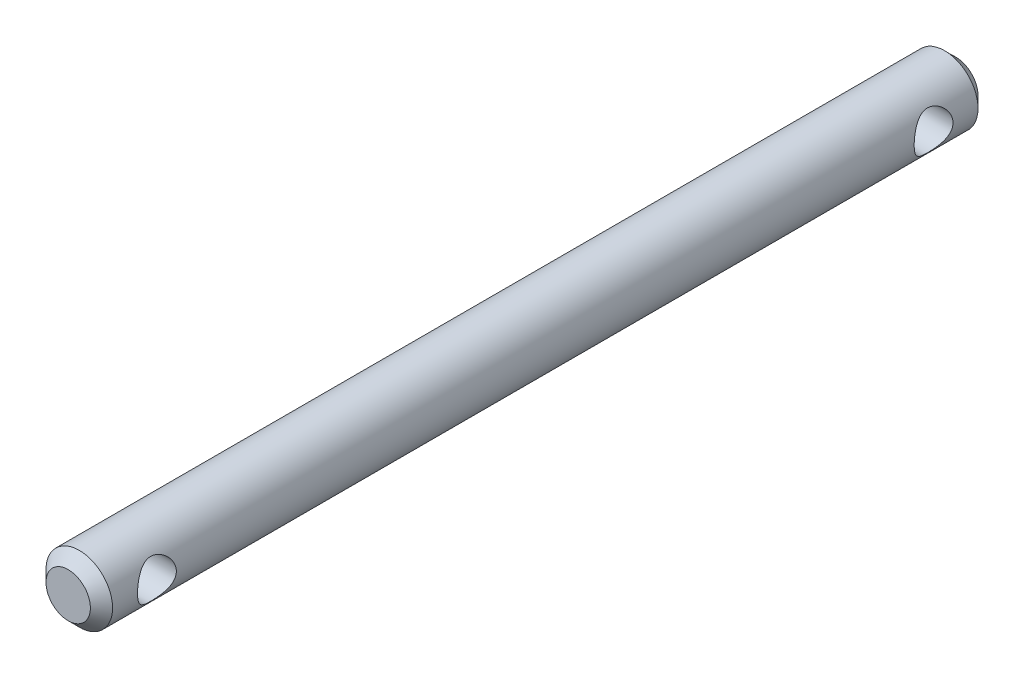
ISO-10303-21;
HEADER;
FILE_DESCRIPTION(('STEP AP214'),'2;1');
FILE_NAME('part.step','',(''),(''),'','','');
FILE_SCHEMA(('AUTOMOTIVE_DESIGN { 1 0 10303 214 1 1 1 1 }'));
ENDSEC;
DATA;
#1=APPLICATION_CONTEXT('core data for automotive mechanical design processes');
#2=APPLICATION_PROTOCOL_DEFINITION('international standard','automotive_design',2000,#1);
#3=PRODUCT_CONTEXT('',#1,'mechanical');
#4=PRODUCT('Part','Part','',(#3));
#5=PRODUCT_RELATED_PRODUCT_CATEGORY('part','',(#4));
#6=PRODUCT_DEFINITION_FORMATION('','',#4);
#7=PRODUCT_DEFINITION_CONTEXT('part definition',#1,'design');
#8=PRODUCT_DEFINITION('design','',#6,#7);
#9=PRODUCT_DEFINITION_SHAPE('','',#8);
#10=(LENGTH_UNIT() NAMED_UNIT(*) SI_UNIT(.MILLI.,.METRE.));
#11=(NAMED_UNIT(*) PLANE_ANGLE_UNIT() SI_UNIT($,.RADIAN.));
#12=(NAMED_UNIT(*) SI_UNIT($,.STERADIAN.) SOLID_ANGLE_UNIT());
#13=UNCERTAINTY_MEASURE_WITH_UNIT(LENGTH_MEASURE(1.E-05),#10,'distance_accuracy_value','');
#14=(GEOMETRIC_REPRESENTATION_CONTEXT(3) GLOBAL_UNCERTAINTY_ASSIGNED_CONTEXT((#13)) GLOBAL_UNIT_ASSIGNED_CONTEXT((#10,
#11,#12)) REPRESENTATION_CONTEXT('',''));
#15=CARTESIAN_POINT('',(0.,0.,0.));
#16=DIRECTION('',(0.,0.,1.));
#17=DIRECTION('',(1.,0.,0.));
#18=AXIS2_PLACEMENT_3D('',#15,#16,#17);
#19=CARTESIAN_POINT('',(0.,0.,5.));
#20=DIRECTION('',(0.,0.,-1.));
#21=DIRECTION('',(-1.,0.,0.));
#22=AXIS2_PLACEMENT_3D('',#19,#20,#21);
#23=CYLINDRICAL_SURFACE('',#22,3.);
#24=CARTESIAN_POINT('',(0.,0.,1.));
#25=DIRECTION('',(0.,0.,1.));
#26=DIRECTION('',(1.,0.,0.));
#27=AXIS2_PLACEMENT_3D('',#24,#25,#26);
#28=CIRCLE('',#27,3.);
#29=CARTESIAN_POINT('',(3.,0.,1.));
#30=VERTEX_POINT('',#29);
#31=EDGE_CURVE('E44',#30,#30,#28,.T.);
#32=ORIENTED_EDGE('',*,*,#31,.T.);
#33=EDGE_LOOP('',(#32));
#34=FACE_BOUND('',#33,.T.);
#35=CARTESIAN_POINT('',(0.,0.,79.));
#36=DIRECTION('',(0.,0.,1.));
#37=DIRECTION('',(1.,0.,0.));
#38=AXIS2_PLACEMENT_3D('',#35,#36,#37);
#39=CIRCLE('',#38,3.);
#40=CARTESIAN_POINT('',(3.,0.,79.));
#41=VERTEX_POINT('',#40);
#42=EDGE_CURVE('E48',#41,#41,#39,.F.);
#43=ORIENTED_EDGE('',*,*,#42,.T.);
#44=EDGE_LOOP('',(#43));
#45=FACE_BOUND('',#44,.T.);
#46=CARTESIAN_POINT('',(-3.,0.,3.25000000000001));
#47=CARTESIAN_POINT('',(-2.99999338722546,0.0899260943450846,3.25000751027514));
#48=CARTESIAN_POINT('',(-2.99591170123809,0.179998893749567,3.25698012617472));
#49=CARTESIAN_POINT('',(-2.97996641346643,0.357477608462208,3.28453477067947));
#50=CARTESIAN_POINT('',(-2.96808104977951,0.444875348469011,3.30515485891316));
#51=CARTESIAN_POINT('',(-2.93774064644758,0.614025151526457,3.35887003140155));
#52=CARTESIAN_POINT('',(-2.91931806060852,0.695802763517553,3.39190353664625));
#53=CARTESIAN_POINT('',(-2.87749372937535,0.852413327579682,3.46914330516881));
#54=CARTESIAN_POINT('',(-2.85409368469238,0.927248639202854,3.51334575317993));
#55=CARTESIAN_POINT('',(-2.80227568751607,1.07412994865769,3.61532619018246));
#56=CARTESIAN_POINT('',(-2.7736144392163,1.14555876319282,3.67386721126581));
#57=CARTESIAN_POINT('',(-2.71505162558485,1.2781872761086,3.80116641983373));
#58=CARTESIAN_POINT('',(-2.6851485576482,1.33937410327363,3.86993726138504));
#59=CARTESIAN_POINT('',(-2.62343929807139,1.45686356139006,4.02502913919282));
#60=CARTESIAN_POINT('',(-2.59180663266207,1.51180708165682,4.11245784899157));
#61=CARTESIAN_POINT('',(-2.53452851602359,1.6059946905633,4.29716099380086));
#62=CARTESIAN_POINT('',(-2.50887371124403,1.64526337520153,4.39441970120854));
#63=CARTESIAN_POINT('',(-2.47262361417559,1.69909798826494,4.57318867258126));
#64=CARTESIAN_POINT('',(-2.45992290524076,1.71726593207437,4.65318612622294));
#65=CARTESIAN_POINT('',(-2.44232499742875,1.74220880806771,4.81574461290588));
#66=CARTESIAN_POINT('',(-2.4374189037159,1.74899672707175,4.8983026140835));
#67=CARTESIAN_POINT('',(-2.43612603576165,1.75079751335569,5.06374616862248));
#68=CARTESIAN_POINT('',(-2.43975285524638,1.74579159193086,5.14663203434673));
#69=CARTESIAN_POINT('',(-2.4550052736622,1.72427221835425,5.31015803323778));
#70=CARTESIAN_POINT('',(-2.46663659340118,1.70775053579178,5.390796517287));
#71=CARTESIAN_POINT('',(-2.49621759524858,1.66420416251993,5.54724492815478));
#72=CARTESIAN_POINT('',(-2.51412014830033,1.63725766204424,5.62308602266895));
#73=CARTESIAN_POINT('',(-2.55431118840022,1.57381751458138,5.76939242100529));
#74=CARTESIAN_POINT('',(-2.57660132438735,1.53732027653725,5.83985568987718));
#75=CARTESIAN_POINT('',(-2.62754339459874,1.44880386712598,5.98585914791748));
#76=CARTESIAN_POINT('',(-2.65663674082645,1.39521241489435,6.06029307260723));
#77=CARTESIAN_POINT('',(-2.71535009643278,1.2771942608156,6.19984908546838));
#78=CARTESIAN_POINT('',(-2.74497055700983,1.21275783328051,6.26496271741439));
#79=CARTESIAN_POINT('',(-2.80573975117748,1.06533337749025,6.39218386074431));
#80=CARTESIAN_POINT('',(-2.83662238285853,0.981035653023078,6.45291688747767));
#81=CARTESIAN_POINT('',(-2.89246450838123,0.801536482279138,6.55913168561216));
#82=CARTESIAN_POINT('',(-2.91742754221545,0.706341603399287,6.60462257875347));
#83=CARTESIAN_POINT('',(-2.9571107689339,0.514251102271474,6.67565251931093));
#84=CARTESIAN_POINT('',(-2.97240570101994,0.41789786694871,6.70232519226128));
#85=CARTESIAN_POINT('',(-2.99347337655183,0.221075458285342,6.73885384221535));
#86=CARTESIAN_POINT('',(-2.99925631377851,0.120610809584663,6.74872782237267));
#87=CARTESIAN_POINT('',(-3.00052359526908,-0.067717403990936,6.75089521955663));
#88=CARTESIAN_POINT('',(-2.99722519897386,-0.155557082863702,6.74526656793966));
#89=CARTESIAN_POINT('',(-2.98319182205348,-0.32881080940009,6.72105536533678));
#90=CARTESIAN_POINT('',(-2.97245681679955,-0.414224849029436,6.70247277144963));
#91=CARTESIAN_POINT('',(-2.94475908509854,-0.579031092089094,6.65363274338209));
#92=CARTESIAN_POINT('',(-2.92789716062393,-0.65849697800528,6.62356389544671));
#93=CARTESIAN_POINT('',(-2.88929746572665,-0.811280788568507,6.5528733099519));
#94=CARTESIAN_POINT('',(-2.86755861456527,-0.884597345554286,6.51224923301219));
#95=CARTESIAN_POINT('',(-2.81835251812346,-1.03125054777328,6.41684661931519));
#96=CARTESIAN_POINT('',(-2.79052428902397,-1.1037917379709,6.36103370963896));
#97=CARTESIAN_POINT('',(-2.7331646699408,-1.23903994969308,6.23918545597162));
#98=CARTESIAN_POINT('',(-2.70363132566081,-1.30173536781872,6.17313823003125));
#99=CARTESIAN_POINT('',(-2.64191747712639,-1.42318031383413,6.02343943938588));
#100=CARTESIAN_POINT('',(-2.60984244163569,-1.4805627405233,5.93862730202317));
#101=CARTESIAN_POINT('',(-2.55075513818308,-1.58019412669645,5.75894963910915));
#102=CARTESIAN_POINT('',(-2.52373664759979,-1.62246174572416,5.66409669803146));
#103=CARTESIAN_POINT('',(-2.48388372009224,-1.68265714440949,5.48772610253366));
#104=CARTESIAN_POINT('',(-2.46924743843143,-1.70386706375961,5.40773889247766));
#105=CARTESIAN_POINT('',(-2.44761658997012,-1.73480246090684,5.24460453170722));
#106=CARTESIAN_POINT('',(-2.44061251706413,-1.74454222628975,5.1614614456635));
#107=CARTESIAN_POINT('',(-2.43526756986959,-1.75199797784207,4.99412339243341));
#108=CARTESIAN_POINT('',(-2.43694993053426,-1.74968171574835,4.90992620565382));
#109=CARTESIAN_POINT('',(-2.44876883220608,-1.73309765744758,4.74330608082372));
#110=CARTESIAN_POINT('',(-2.45891052530542,-1.71882257779048,4.66088425543276));
#111=CARTESIAN_POINT('',(-2.48578933414962,-1.67969834968852,4.50241935989821));
#112=CARTESIAN_POINT('',(-2.50232397669437,-1.6551721029676,4.42626003879547));
#113=CARTESIAN_POINT('',(-2.54013079252814,-1.59654281469425,4.27900056655994));
#114=CARTESIAN_POINT('',(-2.56140475893648,-1.56243614711979,4.20790234375994));
#115=CARTESIAN_POINT('',(-2.61029903994167,-1.47952471389623,4.06102244492513));
#116=CARTESIAN_POINT('',(-2.63839194619498,-1.42926140154465,3.98622193489959));
#117=CARTESIAN_POINT('',(-2.69564120997005,-1.31811740411898,3.84538932838883));
#118=CARTESIAN_POINT('',(-2.72479838666695,-1.2572283980379,3.77936417582575));
#119=CARTESIAN_POINT('',(-2.78571532241789,-1.11644726620307,3.6485122738925));
#120=CARTESIAN_POINT('',(-2.81726705078822,-1.03508780981761,3.5851506195222));
#121=CARTESIAN_POINT('',(-2.87521292497644,-0.861137847178944,3.4730254125696));
#122=CARTESIAN_POINT('',(-2.9016058603848,-0.768544713403447,3.42426528452444));
#123=CARTESIAN_POINT('',(-2.94513750992323,-0.578904287064564,3.34550098845133));
#124=CARTESIAN_POINT('',(-2.96265579406629,-0.482276584546063,3.31471688282412));
#125=CARTESIAN_POINT('',(-2.98178935898444,-0.333826312006081,3.28138392557054));
#126=CARTESIAN_POINT('',(-2.98697473272503,-0.283816471223505,3.27241637711204));
#127=CARTESIAN_POINT('',(-2.99483609603923,-0.183023149242699,3.25885751875788));
#128=CARTESIAN_POINT('',(-2.99751415451088,-0.132240341083972,3.25426260075762));
#129=CARTESIAN_POINT('',(-2.99963295339894,-0.0542562694068386,3.2506296437925));
#130=CARTESIAN_POINT('',(-3.00000199537637,-0.027134813486129,3.24999773380668));
#131=CARTESIAN_POINT('',(-3.,0.,3.25000000000001));
#132=B_SPLINE_CURVE_WITH_KNOTS('',3,(#46,#47,#48,#49,#50,#51,#52,#53,#54,#55,#56,#57,#58,#59,
#60,#61,#62,#63,#64,#65,#66,#67,#68,#69,#70,#71,#72,#73,#74,#75,#76,#77,#78,#79,#80,#81,#82,#83,
#84,#85,#86,#87,#88,#89,#90,#91,#92,#93,#94,#95,#96,#97,#98,#99,#100,#101,#102,#103,#104,#105,
#106,#107,#108,#109,#110,#111,#112,#113,#114,#115,#116,#117,#118,#119,#120,#121,#122,#123,#124,
#125,#126,#127,#128,#129,#130,#131),.UNSPECIFIED.,.T.,.F.,(4,2,2,2,2,2,2,2,2,2,2,2,2,2,2,2,2,2,
2,2,2,2,2,2,2,2,2,2,2,2,2,2,2,2,2,2,2,2,2,2,2,2,4),(0.,0.269682848507375,0.540120966746717,
0.80923486744578,1.07825696388483,1.36720562389127,1.65651472601918,1.97891442487774,
2.3008062261021,2.54877444581717,2.79645949249157,3.04453939165373,3.29279677764287,
3.53922714819382,3.78575030950588,4.07329505075291,4.36109904743875,4.6845988301423,
5.00790466534685,5.30952425878852,5.61082040251298,5.87376281934725,6.1367061070059,
6.39550593899181,6.65436317839364,6.94021883480413,7.22640888861096,7.54680260063234,
7.86679940325802,8.11784613873921,8.36857983060694,8.61998454570947,8.87154248884003,
9.11571156496424,9.35997317962993,9.64208079618312,9.92441033147706,10.246312237478,
10.5682895810184,10.8749947772205,11.0280026433254,11.1808841442313,11.26225978773),.UNSPECIFIED.);
#133=CARTESIAN_POINT('',(-3.,0.,3.25000000000001));
#134=VERTEX_POINT('',#133);
#135=EDGE_CURVE('E53',#134,#134,#132,.T.);
#136=ORIENTED_EDGE('',*,*,#135,.T.);
#137=EDGE_LOOP('',(#136));
#138=FACE_BOUND('',#137,.T.);
#139=CARTESIAN_POINT('',(3.,0.,3.25000000000001));
#140=CARTESIAN_POINT('',(2.99999338722545,-0.0899260943450847,3.25000751027514));
#141=CARTESIAN_POINT('',(2.99591170123809,-0.179998893749567,3.25698012617472));
#142=CARTESIAN_POINT('',(2.97996641346643,-0.357477608462208,3.28453477067947));
#143=CARTESIAN_POINT('',(2.96808104977951,-0.444875348469011,3.30515485891316));
#144=CARTESIAN_POINT('',(2.93774064644758,-0.614025151526457,3.35887003140155));
#145=CARTESIAN_POINT('',(2.91931806060852,-0.695802763517554,3.39190353664625));
#146=CARTESIAN_POINT('',(2.87749372937535,-0.852413327579682,3.46914330516881));
#147=CARTESIAN_POINT('',(2.85409368469238,-0.927248639202854,3.51334575317993));
#148=CARTESIAN_POINT('',(2.80227568751607,-1.07412994865769,3.61532619018246));
#149=CARTESIAN_POINT('',(2.7736144392163,-1.14555876319282,3.67386721126581));
#150=CARTESIAN_POINT('',(2.71505162558485,-1.2781872761086,3.80116641983373));
#151=CARTESIAN_POINT('',(2.6851485576482,-1.33937410327363,3.86993726138504));
#152=CARTESIAN_POINT('',(2.62343929807139,-1.45686356139007,4.02502913919282));
#153=CARTESIAN_POINT('',(2.59180663266207,-1.51180708165682,4.11245784899157));
#154=CARTESIAN_POINT('',(2.53452851602359,-1.60599469056331,4.29716099380086));
#155=CARTESIAN_POINT('',(2.50887371124403,-1.64526337520153,4.39441970120854));
#156=CARTESIAN_POINT('',(2.47262361417559,-1.69909798826494,4.57318867258126));
#157=CARTESIAN_POINT('',(2.45992290524076,-1.71726593207437,4.65318612622294));
#158=CARTESIAN_POINT('',(2.44232499742875,-1.74220880806771,4.81574461290589));
#159=CARTESIAN_POINT('',(2.4374189037159,-1.74899672707175,4.8983026140835));
#160=CARTESIAN_POINT('',(2.43612603576165,-1.75079751335569,5.06374616862248));
#161=CARTESIAN_POINT('',(2.43975285524638,-1.74579159193086,5.14663203434673));
#162=CARTESIAN_POINT('',(2.4550052736622,-1.72427221835425,5.31015803323778));
#163=CARTESIAN_POINT('',(2.46663659340118,-1.70775053579178,5.390796517287));
#164=CARTESIAN_POINT('',(2.49621759524857,-1.66420416251993,5.54724492815478));
#165=CARTESIAN_POINT('',(2.51412014830033,-1.63725766204424,5.62308602266895));
#166=CARTESIAN_POINT('',(2.55431118840022,-1.57381751458138,5.76939242100529));
#167=CARTESIAN_POINT('',(2.57660132438735,-1.53732027653725,5.83985568987718));
#168=CARTESIAN_POINT('',(2.62754339459874,-1.44880386712598,5.98585914791748));
#169=CARTESIAN_POINT('',(2.65663674082645,-1.39521241489435,6.06029307260723));
#170=CARTESIAN_POINT('',(2.71535009643278,-1.2771942608156,6.19984908546838));
#171=CARTESIAN_POINT('',(2.74497055700983,-1.21275783328051,6.26496271741439));
#172=CARTESIAN_POINT('',(2.80573975117748,-1.06533337749025,6.39218386074431));
#173=CARTESIAN_POINT('',(2.83662238285853,-0.981035653023078,6.45291688747768));
#174=CARTESIAN_POINT('',(2.89246450838123,-0.801536482279139,6.55913168561216));
#175=CARTESIAN_POINT('',(2.91742754221545,-0.706341603399287,6.60462257875347));
#176=CARTESIAN_POINT('',(2.9571107689339,-0.514251102271475,6.67565251931093));
#177=CARTESIAN_POINT('',(2.97240570101994,-0.417897866948711,6.70232519226128));
#178=CARTESIAN_POINT('',(2.99347337655183,-0.221075458285343,6.73885384221535));
#179=CARTESIAN_POINT('',(2.99925631377851,-0.120610809584664,6.74872782237267));
#180=CARTESIAN_POINT('',(3.00052359526908,0.0677174039909352,6.75089521955663));
#181=CARTESIAN_POINT('',(2.99722519897386,0.155557082863701,6.74526656793966));
#182=CARTESIAN_POINT('',(2.98319182205348,0.32881080940009,6.72105536533678));
#183=CARTESIAN_POINT('',(2.97245681679955,0.414224849029436,6.70247277144963));
#184=CARTESIAN_POINT('',(2.94475908509854,0.579031092089094,6.65363274338209));
#185=CARTESIAN_POINT('',(2.92789716062393,0.65849697800528,6.62356389544671));
#186=CARTESIAN_POINT('',(2.88929746572665,0.811280788568507,6.5528733099519));
#187=CARTESIAN_POINT('',(2.86755861456527,0.884597345554287,6.51224923301219));
#188=CARTESIAN_POINT('',(2.81835251812346,1.03125054777328,6.41684661931519));
#189=CARTESIAN_POINT('',(2.79052428902397,1.1037917379709,6.36103370963896));
#190=CARTESIAN_POINT('',(2.7331646699408,1.23903994969308,6.23918545597162));
#191=CARTESIAN_POINT('',(2.70363132566081,1.30173536781872,6.17313823003125));
#192=CARTESIAN_POINT('',(2.64191747712639,1.42318031383413,6.02343943938588));
#193=CARTESIAN_POINT('',(2.60984244163569,1.4805627405233,5.93862730202317));
#194=CARTESIAN_POINT('',(2.55075513818308,1.58019412669645,5.75894963910915));
#195=CARTESIAN_POINT('',(2.52373664759979,1.62246174572416,5.66409669803146));
#196=CARTESIAN_POINT('',(2.48388372009224,1.68265714440949,5.48772610253366));
#197=CARTESIAN_POINT('',(2.46924743843143,1.70386706375961,5.40773889247766));
#198=CARTESIAN_POINT('',(2.44761658997012,1.73480246090684,5.24460453170722));
#199=CARTESIAN_POINT('',(2.44061251706413,1.74454222628975,5.1614614456635));
#200=CARTESIAN_POINT('',(2.43526756986959,1.75199797784207,4.99412339243341));
#201=CARTESIAN_POINT('',(2.43694993053426,1.74968171574835,4.90992620565382));
#202=CARTESIAN_POINT('',(2.44876883220608,1.73309765744758,4.74330608082372));
#203=CARTESIAN_POINT('',(2.45891052530542,1.71882257779048,4.66088425543276));
#204=CARTESIAN_POINT('',(2.48578933414961,1.67969834968852,4.50241935989821));
#205=CARTESIAN_POINT('',(2.50232397669437,1.6551721029676,4.42626003879547));
#206=CARTESIAN_POINT('',(2.54013079252814,1.59654281469425,4.27900056655995));
#207=CARTESIAN_POINT('',(2.56140475893648,1.56243614711979,4.20790234375994));
#208=CARTESIAN_POINT('',(2.61029903994167,1.47952471389623,4.06102244492513));
#209=CARTESIAN_POINT('',(2.63839194619498,1.42926140154465,3.98622193489959));
#210=CARTESIAN_POINT('',(2.69564120997005,1.31811740411898,3.84538932838883));
#211=CARTESIAN_POINT('',(2.72479838666695,1.2572283980379,3.77936417582575));
#212=CARTESIAN_POINT('',(2.78571532241789,1.11644726620308,3.6485122738925));
#213=CARTESIAN_POINT('',(2.81726705078822,1.03508780981762,3.58515061952221));
#214=CARTESIAN_POINT('',(2.87521292497644,0.861137847178947,3.47302541256961));
#215=CARTESIAN_POINT('',(2.9016058603848,0.76854471340345,3.42426528452444));
#216=CARTESIAN_POINT('',(2.94513750992323,0.578904287064567,3.34550098845133));
#217=CARTESIAN_POINT('',(2.96265579406629,0.482276584546066,3.31471688282412));
#218=CARTESIAN_POINT('',(2.98178935898444,0.333826312006084,3.28138392557054));
#219=CARTESIAN_POINT('',(2.98697473272503,0.283816471223508,3.27241637711204));
#220=CARTESIAN_POINT('',(2.99483609603923,0.183023149242703,3.25885751875788));
#221=CARTESIAN_POINT('',(2.99751415451088,0.132240341083975,3.25426260075762));
#222=CARTESIAN_POINT('',(2.99963295339894,0.0542562694068405,3.2506296437925));
#223=CARTESIAN_POINT('',(3.00000199537637,0.0271348134861299,3.24999773380668));
#224=CARTESIAN_POINT('',(3.,0.,3.25000000000001));
#225=B_SPLINE_CURVE_WITH_KNOTS('',3,(#139,#140,#141,#142,#143,#144,#145,#146,#147,#148,#149,
#150,#151,#152,#153,#154,#155,#156,#157,#158,#159,#160,#161,#162,#163,#164,#165,#166,#167,#168,
#169,#170,#171,#172,#173,#174,#175,#176,#177,#178,#179,#180,#181,#182,#183,#184,#185,#186,#187,
#188,#189,#190,#191,#192,#193,#194,#195,#196,#197,#198,#199,#200,#201,#202,#203,#204,#205,#206,
#207,#208,#209,#210,#211,#212,#213,#214,#215,#216,#217,#218,#219,#220,#221,#222,#223,#224),
.UNSPECIFIED.,.T.,.F.,(4,2,2,2,2,2,2,2,2,2,2,2,2,2,2,2,2,2,2,2,2,2,2,2,2,2,2,2,2,2,2,2,2,2,2,2,
2,2,2,2,2,2,4),(0.,0.269682848507375,0.540120966746718,0.80923486744578,1.07825696388483,
1.36720562389127,1.65651472601918,1.97891442487774,2.3008062261021,2.54877444581717,
2.79645949249157,3.04453939165373,3.29279677764287,3.53922714819382,3.78575030950588,
4.07329505075291,4.36109904743875,4.6845988301423,5.00790466534685,5.30952425878852,
5.61082040251298,5.87376281934725,6.1367061070059,6.39550593899181,6.65436317839364,
6.94021883480413,7.22640888861096,7.54680260063233,7.86679940325802,8.11784613873921,
8.36857983060694,8.61998454570947,8.87154248884003,9.11571156496424,9.35997317962993,
9.64208079618312,9.92441033147706,10.246312237478,10.5682895810184,10.8749947772205,
11.0280026433254,11.1808841442313,11.26225978773),.UNSPECIFIED.);
#226=CARTESIAN_POINT('',(3.,0.,3.25000000000001));
#227=VERTEX_POINT('',#226);
#228=EDGE_CURVE('E60',#227,#227,#225,.T.);
#229=ORIENTED_EDGE('',*,*,#228,.T.);
#230=EDGE_LOOP('',(#229));
#231=FACE_BOUND('',#230,.T.);
#232=CARTESIAN_POINT('',(-3.,0.,73.25));
#233=CARTESIAN_POINT('',(-2.99999338722546,0.0899260943450839,73.2500075102751));
#234=CARTESIAN_POINT('',(-2.99591170123809,0.179998893749566,73.2569801261747));
#235=CARTESIAN_POINT('',(-2.97996641346643,0.357477608462206,73.2845347706795));
#236=CARTESIAN_POINT('',(-2.96808104977951,0.444875348469009,73.3051548589131));
#237=CARTESIAN_POINT('',(-2.93774064644758,0.614025151526455,73.3588700314015));
#238=CARTESIAN_POINT('',(-2.91931806060852,0.695802763517552,73.3919035366462));
#239=CARTESIAN_POINT('',(-2.87749372937535,0.852413327579678,73.4691433051688));
#240=CARTESIAN_POINT('',(-2.85409368469238,0.927248639202847,73.5133457531799));
#241=CARTESIAN_POINT('',(-2.80227568751607,1.07412994865768,73.6153261901824));
#242=CARTESIAN_POINT('',(-2.7736144392163,1.14555876319282,73.6738672112658));
#243=CARTESIAN_POINT('',(-2.71505162558485,1.2781872761086,73.8011664198337));
#244=CARTESIAN_POINT('',(-2.6851485576482,1.33937410327363,73.869937261385));
#245=CARTESIAN_POINT('',(-2.62343929807139,1.45686356139006,74.0250291391928));
#246=CARTESIAN_POINT('',(-2.59180663266207,1.51180708165682,74.1124578489916));
#247=CARTESIAN_POINT('',(-2.53452851602359,1.60599469056331,74.2971609938009));
#248=CARTESIAN_POINT('',(-2.50887371124403,1.64526337520153,74.3944197012085));
#249=CARTESIAN_POINT('',(-2.47262361417559,1.69909798826494,74.5731886725813));
#250=CARTESIAN_POINT('',(-2.45992290524076,1.71726593207437,74.6531861262229));
#251=CARTESIAN_POINT('',(-2.44232499742875,1.74220880806771,74.8157446129059));
#252=CARTESIAN_POINT('',(-2.43741890371589,1.74899672707175,74.8983026140835));
#253=CARTESIAN_POINT('',(-2.43612603576165,1.75079751335569,75.0637461686225));
#254=CARTESIAN_POINT('',(-2.43975285524638,1.74579159193086,75.1466320343467));
#255=CARTESIAN_POINT('',(-2.4550052736622,1.72427221835425,75.3101580332378));
#256=CARTESIAN_POINT('',(-2.46663659340118,1.70775053579177,75.390796517287));
#257=CARTESIAN_POINT('',(-2.49621759524858,1.66420416251992,75.5472449281548));
#258=CARTESIAN_POINT('',(-2.51412014830034,1.63725766204423,75.623086022669));
#259=CARTESIAN_POINT('',(-2.55431118840023,1.57381751458137,75.7693924210053));
#260=CARTESIAN_POINT('',(-2.57660132438736,1.53732027653723,75.8398556898772));
#261=CARTESIAN_POINT('',(-2.62754339459875,1.44880386712595,75.9858591479175));
#262=CARTESIAN_POINT('',(-2.65663674082647,1.39521241489433,76.0602930726073));
#263=CARTESIAN_POINT('',(-2.7153500964328,1.27719426081557,76.1998490854684));
#264=CARTESIAN_POINT('',(-2.74497055700985,1.21275783328047,76.2649627174144));
#265=CARTESIAN_POINT('',(-2.80573975117749,1.06533337749021,76.3921838607443));
#266=CARTESIAN_POINT('',(-2.83662238285854,0.981035653023036,76.4529168874777));
#267=CARTESIAN_POINT('',(-2.89246450838124,0.801536482279097,76.5591316856122));
#268=CARTESIAN_POINT('',(-2.91742754221546,0.706341603399246,76.6046225787535));
#269=CARTESIAN_POINT('',(-2.95711076893391,0.514251102271433,76.6756525193109));
#270=CARTESIAN_POINT('',(-2.97240570101995,0.417897866948668,76.7023251922613));
#271=CARTESIAN_POINT('',(-2.99347337655184,0.221075458285301,76.7388538422153));
#272=CARTESIAN_POINT('',(-2.99925631377851,0.120610809584623,76.7487278223727));
#273=CARTESIAN_POINT('',(-3.00052359526908,-0.0677174039909738,76.7508952195566));
#274=CARTESIAN_POINT('',(-2.99722519897386,-0.155557082863739,76.7452665679397));
#275=CARTESIAN_POINT('',(-2.98319182205348,-0.328810809400126,76.7210553653368));
#276=CARTESIAN_POINT('',(-2.97245681679955,-0.414224849029472,76.7024727714496));
#277=CARTESIAN_POINT('',(-2.94475908509853,-0.579031092089128,76.6536327433821));
#278=CARTESIAN_POINT('',(-2.92789716062393,-0.658496978005312,76.6235638954467));
#279=CARTESIAN_POINT('',(-2.88929746572664,-0.811280788568538,76.5528733099519));
#280=CARTESIAN_POINT('',(-2.86755861456526,-0.884597345554317,76.5122492330122));
#281=CARTESIAN_POINT('',(-2.81835251812345,-1.03125054777331,76.4168466193152));
#282=CARTESIAN_POINT('',(-2.79052428902395,-1.10379173797093,76.3610337096389));
#283=CARTESIAN_POINT('',(-2.73316466994079,-1.23903994969311,76.2391854559716));
#284=CARTESIAN_POINT('',(-2.70363132566079,-1.30173536781874,76.1731382300312));
#285=CARTESIAN_POINT('',(-2.64191747712637,-1.42318031383416,76.0234394393858));
#286=CARTESIAN_POINT('',(-2.60984244163568,-1.48056274052332,75.9386273020231));
#287=CARTESIAN_POINT('',(-2.55075513818306,-1.58019412669647,75.7589496391091));
#288=CARTESIAN_POINT('',(-2.52373664759978,-1.62246174572417,75.6640966980314));
#289=CARTESIAN_POINT('',(-2.48388372009224,-1.6826571444095,75.4877261025336));
#290=CARTESIAN_POINT('',(-2.46924743843143,-1.70386706375962,75.4077388924776));
#291=CARTESIAN_POINT('',(-2.44761658997011,-1.73480246090685,75.2446045317072));
#292=CARTESIAN_POINT('',(-2.44061251706413,-1.74454222628975,75.1614614456635));
#293=CARTESIAN_POINT('',(-2.43526756986959,-1.75199797784207,74.9941233924334));
#294=CARTESIAN_POINT('',(-2.43694993053426,-1.74968171574835,74.9099262056538));
#295=CARTESIAN_POINT('',(-2.44876883220609,-1.73309765744758,74.7433060808237));
#296=CARTESIAN_POINT('',(-2.45891052530542,-1.71882257779047,74.6608842554327));
#297=CARTESIAN_POINT('',(-2.48578933414962,-1.67969834968852,74.5024193598982));
#298=CARTESIAN_POINT('',(-2.50232397669438,-1.65517210296759,74.4262600387954));
#299=CARTESIAN_POINT('',(-2.54013079252815,-1.59654281469424,74.2790005665599));
#300=CARTESIAN_POINT('',(-2.56140475893649,-1.56243614711977,74.2079023437599));
#301=CARTESIAN_POINT('',(-2.61029903994168,-1.47952471389621,74.0610224449251));
#302=CARTESIAN_POINT('',(-2.63839194619499,-1.42926140154463,73.9862219348995));
#303=CARTESIAN_POINT('',(-2.69564120997006,-1.31811740411895,73.8453893283888));
#304=CARTESIAN_POINT('',(-2.72479838666696,-1.25722839803788,73.7793641758257));
#305=CARTESIAN_POINT('',(-2.7857153224179,-1.11644726620305,73.6485122738925));
#306=CARTESIAN_POINT('',(-2.81726705078823,-1.03508780981759,73.5851506195222));
#307=CARTESIAN_POINT('',(-2.87521292497645,-0.861137847178924,73.4730254125696));
#308=CARTESIAN_POINT('',(-2.9016058603848,-0.768544713403428,73.4242652845244));
#309=CARTESIAN_POINT('',(-2.94513750992323,-0.578904287064546,73.3455009884513));
#310=CARTESIAN_POINT('',(-2.9626557940663,-0.482276584546044,73.3147168828241));
#311=CARTESIAN_POINT('',(-2.98178935898444,-0.33382631200606,73.2813839255705));
#312=CARTESIAN_POINT('',(-2.98697473272503,-0.283816471223484,73.272416377112));
#313=CARTESIAN_POINT('',(-2.99483609603923,-0.183023149242676,73.2588575187579));
#314=CARTESIAN_POINT('',(-2.99751415451088,-0.132240341083946,73.2542626007576));
#315=CARTESIAN_POINT('',(-2.99963295339894,-0.0542562694068202,73.2506296437925));
#316=CARTESIAN_POINT('',(-3.00000199537637,-0.0271348134861198,73.2499977338067));
#317=CARTESIAN_POINT('',(-3.,0.,73.25));
#318=B_SPLINE_CURVE_WITH_KNOTS('',3,(#232,#233,#234,#235,#236,#237,#238,#239,#240,#241,#242,
#243,#244,#245,#246,#247,#248,#249,#250,#251,#252,#253,#254,#255,#256,#257,#258,#259,#260,#261,
#262,#263,#264,#265,#266,#267,#268,#269,#270,#271,#272,#273,#274,#275,#276,#277,#278,#279,#280,
#281,#282,#283,#284,#285,#286,#287,#288,#289,#290,#291,#292,#293,#294,#295,#296,#297,#298,#299,
#300,#301,#302,#303,#304,#305,#306,#307,#308,#309,#310,#311,#312,#313,#314,#315,#316,#317),
.UNSPECIFIED.,.T.,.F.,(4,2,2,2,2,2,2,2,2,2,2,2,2,2,2,2,2,2,2,2,2,2,2,2,2,2,2,2,2,2,2,2,2,2,2,2,
2,2,2,2,2,2,4),(0.,0.269682848507373,0.540120966746716,0.809234867445775,1.07825696388482,
1.36720562389127,1.65651472601918,1.97891442487774,2.30080622610211,2.54877444581719,
2.7964594924916,3.04453939165374,3.2927967776429,3.53922714819385,3.78575030950592,
4.07329505075296,4.36109904743881,4.68459883014235,5.00790466534689,5.30952425878856,
5.61082040251302,5.87376281934729,6.13670610700593,6.39550593899185,6.65436317839368,
6.94021883480418,7.226408888611,7.54680260063238,7.86679940325806,8.11784613873924,
8.36857983060697,8.6199845457095,8.87154248884005,9.11571156496426,9.35997317962996,
9.64208079618316,9.9244103314771,10.246312237478,10.5682895810184,10.8749947772205,
11.0280026433255,11.1808841442313,11.26225978773),.UNSPECIFIED.);
#319=CARTESIAN_POINT('',(-3.,0.,73.25));
#320=VERTEX_POINT('',#319);
#321=EDGE_CURVE('E84',#320,#320,#318,.T.);
#322=ORIENTED_EDGE('',*,*,#321,.T.);
#323=EDGE_LOOP('',(#322));
#324=FACE_BOUND('',#323,.T.);
#325=CARTESIAN_POINT('',(3.,0.,73.25));
#326=CARTESIAN_POINT('',(2.99999338722545,-0.0899260943450839,73.2500075102751));
#327=CARTESIAN_POINT('',(2.99591170123809,-0.179998893749566,73.2569801261747));
#328=CARTESIAN_POINT('',(2.97996641346643,-0.357477608462206,73.2845347706795));
#329=CARTESIAN_POINT('',(2.96808104977951,-0.444875348469009,73.3051548589131));
#330=CARTESIAN_POINT('',(2.93774064644758,-0.614025151526455,73.3588700314015));
#331=CARTESIAN_POINT('',(2.91931806060852,-0.695802763517552,73.3919035366462));
#332=CARTESIAN_POINT('',(2.87749372937535,-0.852413327579678,73.4691433051688));
#333=CARTESIAN_POINT('',(2.85409368469238,-0.927248639202848,73.5133457531799));
#334=CARTESIAN_POINT('',(2.80227568751607,-1.07412994865768,73.6153261901825));
#335=CARTESIAN_POINT('',(2.7736144392163,-1.14555876319282,73.6738672112658));
#336=CARTESIAN_POINT('',(2.71505162558485,-1.2781872761086,73.8011664198337));
#337=CARTESIAN_POINT('',(2.6851485576482,-1.33937410327364,73.869937261385));
#338=CARTESIAN_POINT('',(2.62343929807139,-1.45686356139007,74.0250291391928));
#339=CARTESIAN_POINT('',(2.59180663266206,-1.51180708165682,74.1124578489916));
#340=CARTESIAN_POINT('',(2.53452851602359,-1.60599469056331,74.2971609938009));
#341=CARTESIAN_POINT('',(2.50887371124403,-1.64526337520153,74.3944197012085));
#342=CARTESIAN_POINT('',(2.47262361417559,-1.69909798826494,74.5731886725813));
#343=CARTESIAN_POINT('',(2.45992290524076,-1.71726593207437,74.6531861262229));
#344=CARTESIAN_POINT('',(2.44232499742875,-1.74220880806771,74.8157446129059));
#345=CARTESIAN_POINT('',(2.43741890371589,-1.74899672707175,74.8983026140835));
#346=CARTESIAN_POINT('',(2.43612603576165,-1.75079751335569,75.0637461686225));
#347=CARTESIAN_POINT('',(2.43975285524638,-1.74579159193086,75.1466320343467));
#348=CARTESIAN_POINT('',(2.4550052736622,-1.72427221835425,75.3101580332378));
#349=CARTESIAN_POINT('',(2.46663659340118,-1.70775053579177,75.390796517287));
#350=CARTESIAN_POINT('',(2.49621759524858,-1.66420416251992,75.5472449281548));
#351=CARTESIAN_POINT('',(2.51412014830034,-1.63725766204423,75.623086022669));
#352=CARTESIAN_POINT('',(2.55431118840023,-1.57381751458137,75.7693924210053));
#353=CARTESIAN_POINT('',(2.57660132438736,-1.53732027653723,75.8398556898772));
#354=CARTESIAN_POINT('',(2.62754339459875,-1.44880386712595,75.9858591479175));
#355=CARTESIAN_POINT('',(2.65663674082647,-1.39521241489433,76.0602930726073));
#356=CARTESIAN_POINT('',(2.7153500964328,-1.27719426081558,76.1998490854684));
#357=CARTESIAN_POINT('',(2.74497055700984,-1.21275783328048,76.2649627174144));
#358=CARTESIAN_POINT('',(2.80573975117749,-1.06533337749023,76.3921838607443));
#359=CARTESIAN_POINT('',(2.83662238285854,-0.981035653023047,76.4529168874777));
#360=CARTESIAN_POINT('',(2.89246450838124,-0.801536482279103,76.5591316856122));
#361=CARTESIAN_POINT('',(2.91742754221546,-0.706341603399249,76.6046225787535));
#362=CARTESIAN_POINT('',(2.95711076893391,-0.514251102271434,76.6756525193109));
#363=CARTESIAN_POINT('',(2.97240570101995,-0.41789786694867,76.7023251922613));
#364=CARTESIAN_POINT('',(2.99347337655184,-0.221075458285303,76.7388538422153));
#365=CARTESIAN_POINT('',(2.99925631377851,-0.120610809584623,76.7487278223727));
#366=CARTESIAN_POINT('',(3.00052359526908,0.0677174039909756,76.7508952195566));
#367=CARTESIAN_POINT('',(2.99722519897385,0.155557082863741,76.7452665679397));
#368=CARTESIAN_POINT('',(2.98319182205348,0.328810809400128,76.7210553653368));
#369=CARTESIAN_POINT('',(2.97245681679955,0.414224849029473,76.7024727714496));
#370=CARTESIAN_POINT('',(2.94475908509853,0.579031092089126,76.6536327433821));
#371=CARTESIAN_POINT('',(2.92789716062393,0.658496978005307,76.6235638954467));
#372=CARTESIAN_POINT('',(2.88929746572664,0.811280788568533,76.5528733099519));
#373=CARTESIAN_POINT('',(2.86755861456526,0.884597345554315,76.5122492330122));
#374=CARTESIAN_POINT('',(2.81835251812345,1.03125054777331,76.4168466193152));
#375=CARTESIAN_POINT('',(2.79052428902395,1.10379173797093,76.3610337096389));
#376=CARTESIAN_POINT('',(2.73316466994079,1.23903994969311,76.2391854559716));
#377=CARTESIAN_POINT('',(2.70363132566079,1.30173536781875,76.1731382300312));
#378=CARTESIAN_POINT('',(2.64191747712637,1.42318031383416,76.0234394393858));
#379=CARTESIAN_POINT('',(2.60984244163568,1.48056274052332,75.9386273020231));
#380=CARTESIAN_POINT('',(2.55075513818306,1.58019412669647,75.7589496391091));
#381=CARTESIAN_POINT('',(2.52373664759978,1.62246174572417,75.6640966980314));
#382=CARTESIAN_POINT('',(2.48388372009224,1.68265714440951,75.4877261025336));
#383=CARTESIAN_POINT('',(2.46924743843143,1.70386706375962,75.4077388924776));
#384=CARTESIAN_POINT('',(2.44761658997011,1.73480246090685,75.2446045317072));
#385=CARTESIAN_POINT('',(2.44061251706413,1.74454222628975,75.1614614456635));
#386=CARTESIAN_POINT('',(2.43526756986959,1.75199797784207,74.9941233924334));
#387=CARTESIAN_POINT('',(2.43694993053426,1.74968171574835,74.9099262056538));
#388=CARTESIAN_POINT('',(2.44876883220609,1.73309765744758,74.7433060808237));
#389=CARTESIAN_POINT('',(2.45891052530542,1.71882257779047,74.6608842554327));
#390=CARTESIAN_POINT('',(2.48578933414962,1.67969834968852,74.5024193598982));
#391=CARTESIAN_POINT('',(2.50232397669438,1.65517210296758,74.4262600387954));
#392=CARTESIAN_POINT('',(2.54013079252815,1.59654281469424,74.2790005665599));
#393=CARTESIAN_POINT('',(2.56140475893649,1.56243614711977,74.2079023437599));
#394=CARTESIAN_POINT('',(2.61029903994168,1.47952471389621,74.0610224449251));
#395=CARTESIAN_POINT('',(2.63839194619499,1.42926140154463,73.9862219348995));
#396=CARTESIAN_POINT('',(2.69564120997006,1.31811740411895,73.8453893283888));
#397=CARTESIAN_POINT('',(2.72479838666696,1.25722839803788,73.7793641758257));
#398=CARTESIAN_POINT('',(2.7857153224179,1.11644726620305,73.6485122738925));
#399=CARTESIAN_POINT('',(2.81726705078824,1.03508780981759,73.5851506195222));
#400=CARTESIAN_POINT('',(2.87521292497645,0.861137847178915,73.4730254125696));
#401=CARTESIAN_POINT('',(2.90160586038481,0.768544713403417,73.4242652845244));
#402=CARTESIAN_POINT('',(2.94513750992323,0.578904287064531,73.3455009884513));
#403=CARTESIAN_POINT('',(2.9626557940663,0.482276584546028,73.3147168828241));
#404=CARTESIAN_POINT('',(2.98178935898444,0.333826312006047,73.2813839255705));
#405=CARTESIAN_POINT('',(2.98697473272503,0.283816471223471,73.272416377112));
#406=CARTESIAN_POINT('',(2.99483609603923,0.183023149242667,73.2588575187579));
#407=CARTESIAN_POINT('',(2.99751415451089,0.132240341083939,73.2542626007576));
#408=CARTESIAN_POINT('',(2.99963295339894,0.0542562694068166,73.2506296437925));
#409=CARTESIAN_POINT('',(3.00000199537637,0.0271348134861179,73.2499977338067));
#410=CARTESIAN_POINT('',(3.,0.,73.25));
#411=B_SPLINE_CURVE_WITH_KNOTS('',3,(#325,#326,#327,#328,#329,#330,#331,#332,#333,#334,#335,
#336,#337,#338,#339,#340,#341,#342,#343,#344,#345,#346,#347,#348,#349,#350,#351,#352,#353,#354,
#355,#356,#357,#358,#359,#360,#361,#362,#363,#364,#365,#366,#367,#368,#369,#370,#371,#372,#373,
#374,#375,#376,#377,#378,#379,#380,#381,#382,#383,#384,#385,#386,#387,#388,#389,#390,#391,#392,
#393,#394,#395,#396,#397,#398,#399,#400,#401,#402,#403,#404,#405,#406,#407,#408,#409,#410),
.UNSPECIFIED.,.T.,.F.,(4,2,2,2,2,2,2,2,2,2,2,2,2,2,2,2,2,2,2,2,2,2,2,2,2,2,2,2,2,2,2,2,2,2,2,2,
2,2,2,2,2,2,4),(0.,0.269682848507373,0.540120966746716,0.809234867445774,1.07825696388482,
1.36720562389128,1.65651472601918,1.97891442487774,2.30080622610211,2.54877444581718,
2.7964594924916,3.04453939165374,3.2927967776429,3.53922714819385,3.78575030950592,
4.07329505075296,4.36109904743879,4.68459883014234,5.00790466534689,5.30952425878856,
5.61082040251302,5.87376281934729,6.13670610700593,6.39550593899183,6.65436317839368,
6.94021883480418,7.226408888611,7.54680260063238,7.86679940325806,8.11784613873924,
8.36857983060698,8.61998454570951,8.87154248884007,9.11571156496428,9.35997317962996,
9.64208079618317,9.9244103314771,10.2463122374781,10.5682895810184,10.8749947772205,
11.0280026433255,11.1808841442313,11.26225978773),.UNSPECIFIED.);
#412=CARTESIAN_POINT('',(3.,0.,73.25));
#413=VERTEX_POINT('',#412);
#414=EDGE_CURVE('E81',#413,#413,#411,.T.);
#415=ORIENTED_EDGE('',*,*,#414,.T.);
#416=EDGE_LOOP('',(#415));
#417=FACE_BOUND('',#416,.T.);
#418=ADVANCED_FACE('F33',(#34,#45,#138,#231,#324,#417),#23,.T.);
#419=CARTESIAN_POINT('',(0.,0.,0.));
#420=DIRECTION('',(0.,0.,1.));
#421=DIRECTION('',(1.,0.,0.));
#422=AXIS2_PLACEMENT_3D('',#419,#420,#421);
#423=PLANE('',#422);
#424=CARTESIAN_POINT('',(0.,0.,0.));
#425=DIRECTION('',(0.,0.,1.));
#426=DIRECTION('',(1.,0.,0.));
#427=AXIS2_PLACEMENT_3D('',#424,#425,#426);
#428=CIRCLE('',#427,2.);
#429=CARTESIAN_POINT('',(2.,0.,0.));
#430=VERTEX_POINT('',#429);
#431=EDGE_CURVE('E40',#430,#430,#428,.F.);
#432=ORIENTED_EDGE('',*,*,#431,.T.);
#433=EDGE_LOOP('',(#432));
#434=FACE_BOUND('',#433,.T.);
#435=ADVANCED_FACE('F96',(#434),#423,.F.);
#436=CARTESIAN_POINT('',(0.,0.,80.));
#437=DIRECTION('',(0.,0.,1.));
#438=DIRECTION('',(1.,0.,0.));
#439=AXIS2_PLACEMENT_3D('',#436,#437,#438);
#440=PLANE('',#439);
#441=CARTESIAN_POINT('',(0.,0.,80.));
#442=DIRECTION('',(0.,0.,1.));
#443=DIRECTION('',(1.,0.,0.));
#444=AXIS2_PLACEMENT_3D('',#441,#442,#443);
#445=CIRCLE('',#444,1.99999999999999);
#446=CARTESIAN_POINT('',(1.99999999999999,0.,80.));
#447=VERTEX_POINT('',#446);
#448=EDGE_CURVE('E10',#447,#447,#445,.T.);
#449=ORIENTED_EDGE('',*,*,#448,.T.);
#450=EDGE_LOOP('',(#449));
#451=FACE_BOUND('',#450,.T.);
#452=ADVANCED_FACE('F77',(#451),#440,.T.);
#453=CARTESIAN_POINT('',(-3.,0.,75.));
#454=DIRECTION('',(1.,0.,0.));
#455=DIRECTION('',(0.,0.,-1.));
#456=AXIS2_PLACEMENT_3D('',#453,#454,#455);
#457=CYLINDRICAL_SURFACE('',#456,1.75);
#458=ORIENTED_EDGE('',*,*,#414,.F.);
#459=EDGE_LOOP('',(#458));
#460=FACE_BOUND('',#459,.T.);
#461=ORIENTED_EDGE('',*,*,#321,.F.);
#462=EDGE_LOOP('',(#461));
#463=FACE_BOUND('',#462,.T.);
#464=ADVANCED_FACE('F71',(#460,#463),#457,.F.);
#465=CARTESIAN_POINT('',(-3.,0.,5.));
#466=DIRECTION('',(1.,0.,0.));
#467=DIRECTION('',(0.,0.,-1.));
#468=AXIS2_PLACEMENT_3D('',#465,#466,#467);
#469=CYLINDRICAL_SURFACE('',#468,1.75);
#470=ORIENTED_EDGE('',*,*,#228,.F.);
#471=EDGE_LOOP('',(#470));
#472=FACE_BOUND('',#471,.T.);
#473=ORIENTED_EDGE('',*,*,#135,.F.);
#474=EDGE_LOOP('',(#473));
#475=FACE_BOUND('',#474,.T.);
#476=ADVANCED_FACE('F66',(#472,#475),#469,.F.);
#477=CARTESIAN_POINT('',(0.,0.,1.));
#478=DIRECTION('',(0.,0.,1.));
#479=DIRECTION('',(1.,0.,0.));
#480=AXIS2_PLACEMENT_3D('',#477,#478,#479);
#481=CONICAL_SURFACE('',#480,3.,0.785398163397447);
#482=ORIENTED_EDGE('',*,*,#431,.F.);
#483=EDGE_LOOP('',(#482));
#484=FACE_BOUND('',#483,.T.);
#485=ORIENTED_EDGE('',*,*,#31,.F.);
#486=EDGE_LOOP('',(#485));
#487=FACE_BOUND('',#486,.T.);
#488=ADVANCED_FACE('F70',(#484,#487),#481,.T.);
#489=CARTESIAN_POINT('',(0.,0.,80.));
#490=DIRECTION('',(0.,0.,-1.));
#491=DIRECTION('',(-1.,0.,0.));
#492=AXIS2_PLACEMENT_3D('',#489,#490,#491);
#493=CONICAL_SURFACE('',#492,1.99999999999999,0.785398163397444);
#494=ORIENTED_EDGE('',*,*,#42,.F.);
#495=EDGE_LOOP('',(#494));
#496=FACE_BOUND('',#495,.T.);
#497=ORIENTED_EDGE('',*,*,#448,.F.);
#498=EDGE_LOOP('',(#497));
#499=FACE_BOUND('',#498,.T.);
#500=ADVANCED_FACE('F35',(#496,#499),#493,.T.);
#501=CLOSED_SHELL('',(#418,#435,#452,#464,#476,#488,#500));
#502=MANIFOLD_SOLID_BREP('B2',#501);
#503=ADVANCED_BREP_SHAPE_REPRESENTATION('',(#18,#502),#14);
#504=SHAPE_DEFINITION_REPRESENTATION(#9,#503);
ENDSEC;
END-ISO-10303-21;
